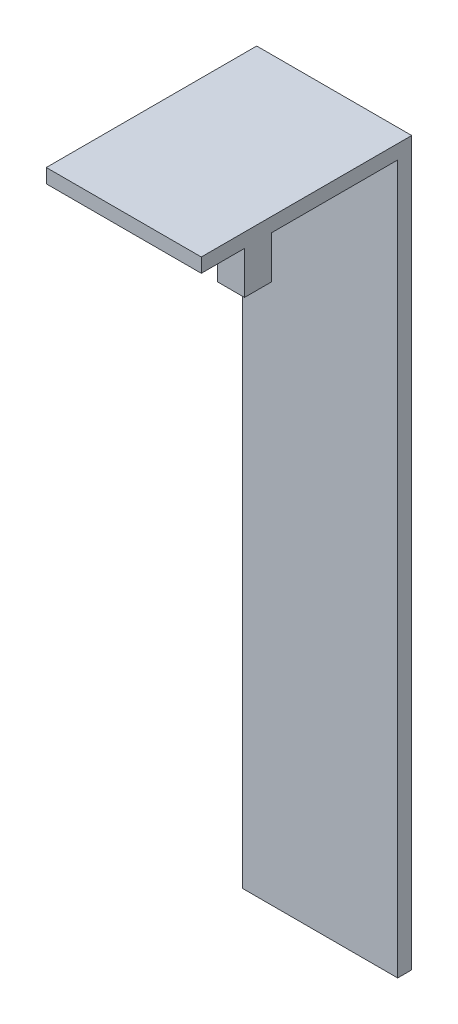
ISO-10303-21;
HEADER;
FILE_DESCRIPTION(('STEP AP214'),'2;1');
FILE_NAME('part.step','',(''),(''),'','','');
FILE_SCHEMA(('AUTOMOTIVE_DESIGN { 1 0 10303 214 1 1 1 1 }'));
ENDSEC;
DATA;
#1=APPLICATION_CONTEXT('core data for automotive mechanical design processes');
#2=APPLICATION_PROTOCOL_DEFINITION('international standard','automotive_design',2000,#1);
#3=PRODUCT_CONTEXT('',#1,'mechanical');
#4=PRODUCT('Part','Part','',(#3));
#5=PRODUCT_RELATED_PRODUCT_CATEGORY('part','',(#4));
#6=PRODUCT_DEFINITION_FORMATION('','',#4);
#7=PRODUCT_DEFINITION_CONTEXT('part definition',#1,'design');
#8=PRODUCT_DEFINITION('design','',#6,#7);
#9=PRODUCT_DEFINITION_SHAPE('','',#8);
#10=(LENGTH_UNIT() NAMED_UNIT(*) SI_UNIT(.MILLI.,.METRE.));
#11=(NAMED_UNIT(*) PLANE_ANGLE_UNIT() SI_UNIT($,.RADIAN.));
#12=(NAMED_UNIT(*) SI_UNIT($,.STERADIAN.) SOLID_ANGLE_UNIT());
#13=UNCERTAINTY_MEASURE_WITH_UNIT(LENGTH_MEASURE(1.E-05),#10,'distance_accuracy_value','');
#14=(GEOMETRIC_REPRESENTATION_CONTEXT(3) GLOBAL_UNCERTAINTY_ASSIGNED_CONTEXT((#13)) GLOBAL_UNIT_ASSIGNED_CONTEXT((#10,
#11,#12)) REPRESENTATION_CONTEXT('',''));
#15=CARTESIAN_POINT('',(0.,0.,0.));
#16=DIRECTION('',(0.,0.,1.));
#17=DIRECTION('',(1.,0.,0.));
#18=AXIS2_PLACEMENT_3D('',#15,#16,#17);
#19=CARTESIAN_POINT('',(0.,0.,0.));
#20=DIRECTION('',(0.,1.,0.));
#21=DIRECTION('',(0.,0.,1.));
#22=AXIS2_PLACEMENT_3D('',#19,#20,#21);
#23=PLANE('',#22);
#24=DIRECTION('',(-1.,0.,0.));
#25=VECTOR('',#24,1.);
#26=CARTESIAN_POINT('',(0.,0.,-8.91));
#27=LINE('',#26,#25);
#28=CARTESIAN_POINT('',(5.46975,0.,-8.91));
#29=VERTEX_POINT('',#28);
#30=CARTESIAN_POINT('',(-5.46975,0.,-8.91));
#31=VERTEX_POINT('',#30);
#32=EDGE_CURVE('E170',#29,#31,#27,.T.);
#33=ORIENTED_EDGE('',*,*,#32,.F.);
#34=DIRECTION('',(0.,0.,1.));
#35=VECTOR('',#34,1.);
#36=CARTESIAN_POINT('',(5.46975,0.,0.));
#37=LINE('',#36,#35);
#38=CARTESIAN_POINT('',(5.46975,0.,0.));
#39=VERTEX_POINT('',#38);
#40=EDGE_CURVE('E161',#29,#39,#37,.T.);
#41=ORIENTED_EDGE('',*,*,#40,.T.);
#42=DIRECTION('',(1.,0.,0.));
#43=VECTOR('',#42,1.);
#44=CARTESIAN_POINT('',(0.,0.,0.));
#45=LINE('',#44,#43);
#46=CARTESIAN_POINT('',(3.56974999999999,0.,0.));
#47=VERTEX_POINT('',#46);
#48=EDGE_CURVE('E199',#47,#39,#45,.T.);
#49=ORIENTED_EDGE('',*,*,#48,.F.);
#50=DIRECTION('',(0.,0.,-1.));
#51=VECTOR('',#50,1.);
#52=CARTESIAN_POINT('',(3.56974999999999,0.,0.));
#53=LINE('',#52,#51);
#54=CARTESIAN_POINT('',(3.56975,0.,1.89999999999999));
#55=VERTEX_POINT('',#54);
#56=EDGE_CURVE('E64',#55,#47,#53,.T.);
#57=ORIENTED_EDGE('',*,*,#56,.F.);
#58=DIRECTION('',(-1.,0.,0.));
#59=VECTOR('',#58,1.);
#60=CARTESIAN_POINT('',(0.,0.,1.9));
#61=LINE('',#60,#59);
#62=CARTESIAN_POINT('',(5.46975,0.,1.89999999999999));
#63=VERTEX_POINT('',#62);
#64=EDGE_CURVE('E180',#63,#55,#61,.T.);
#65=ORIENTED_EDGE('',*,*,#64,.F.);
#66=CARTESIAN_POINT('',(5.46975,0.,4.95));
#67=VERTEX_POINT('',#66);
#68=EDGE_CURVE('E281',#63,#67,#37,.T.);
#69=ORIENTED_EDGE('',*,*,#68,.T.);
#70=DIRECTION('',(1.,0.,0.));
#71=VECTOR('',#70,1.);
#72=CARTESIAN_POINT('',(0.,0.,4.95));
#73=LINE('',#72,#71);
#74=CARTESIAN_POINT('',(-5.46975,0.,4.95));
#75=VERTEX_POINT('',#74);
#76=EDGE_CURVE('E277',#75,#67,#73,.T.);
#77=ORIENTED_EDGE('',*,*,#76,.F.);
#78=DIRECTION('',(0.,0.,-1.));
#79=VECTOR('',#78,1.);
#80=CARTESIAN_POINT('',(-5.46975,0.,0.));
#81=LINE('',#80,#79);
#82=CARTESIAN_POINT('',(-5.46975,0.,1.9));
#83=VERTEX_POINT('',#82);
#84=EDGE_CURVE('E273',#75,#83,#81,.T.);
#85=ORIENTED_EDGE('',*,*,#84,.T.);
#86=DIRECTION('',(1.,0.,0.));
#87=VECTOR('',#86,1.);
#88=CARTESIAN_POINT('',(0.,0.,1.9));
#89=LINE('',#88,#87);
#90=CARTESIAN_POINT('',(-3.56975,0.,1.9));
#91=VERTEX_POINT('',#90);
#92=EDGE_CURVE('E224',#83,#91,#89,.T.);
#93=ORIENTED_EDGE('',*,*,#92,.T.);
#94=DIRECTION('',(0.,0.,-1.));
#95=VECTOR('',#94,1.);
#96=CARTESIAN_POINT('',(-3.56975,0.,0.));
#97=LINE('',#96,#95);
#98=CARTESIAN_POINT('',(-3.56975,0.,0.));
#99=VERTEX_POINT('',#98);
#100=EDGE_CURVE('E208',#91,#99,#97,.T.);
#101=ORIENTED_EDGE('',*,*,#100,.T.);
#102=DIRECTION('',(-1.,0.,0.));
#103=VECTOR('',#102,1.);
#104=CARTESIAN_POINT('',(0.,0.,0.));
#105=LINE('',#104,#103);
#106=CARTESIAN_POINT('',(-5.46975,0.,0.));
#107=VERTEX_POINT('',#106);
#108=EDGE_CURVE('E239',#99,#107,#105,.T.);
#109=ORIENTED_EDGE('',*,*,#108,.T.);
#110=EDGE_CURVE('E57',#107,#31,#81,.T.);
#111=ORIENTED_EDGE('',*,*,#110,.T.);
#112=EDGE_LOOP('',(#33,#41,#49,#57,#65,#69,#77,#85,#93,#101,#109,#111));
#113=FACE_BOUND('',#112,.T.);
#114=ADVANCED_FACE('F41',(#113),#23,.F.);
#115=CARTESIAN_POINT('',(0.,1.,-9.9));
#116=DIRECTION('',(0.,0.,-1.));
#117=DIRECTION('',(-1.,0.,0.));
#118=AXIS2_PLACEMENT_3D('',#115,#116,#117);
#119=PLANE('',#118);
#120=DIRECTION('',(0.,-1.,0.));
#121=VECTOR('',#120,1.);
#122=CARTESIAN_POINT('',(5.46975,1.,-9.9));
#123=LINE('',#122,#121);
#124=CARTESIAN_POINT('',(5.46975,1.,-9.9));
#125=VERTEX_POINT('',#124);
#126=CARTESIAN_POINT('',(5.46975,-50.,-9.9));
#127=VERTEX_POINT('',#126);
#128=EDGE_CURVE('E272',#125,#127,#123,.T.);
#129=ORIENTED_EDGE('',*,*,#128,.T.);
#130=DIRECTION('',(1.,0.,0.));
#131=VECTOR('',#130,1.);
#132=CARTESIAN_POINT('',(0.,-50.,-9.9));
#133=LINE('',#132,#131);
#134=CARTESIAN_POINT('',(-5.46975,-50.,-9.9));
#135=VERTEX_POINT('',#134);
#136=EDGE_CURVE('E153',#135,#127,#133,.T.);
#137=ORIENTED_EDGE('',*,*,#136,.F.);
#138=DIRECTION('',(0.,-1.,0.));
#139=VECTOR('',#138,1.);
#140=CARTESIAN_POINT('',(-5.46975,1.,-9.9));
#141=LINE('',#140,#139);
#142=CARTESIAN_POINT('',(-5.46975,1.,-9.9));
#143=VERTEX_POINT('',#142);
#144=EDGE_CURVE('E11',#143,#135,#141,.T.);
#145=ORIENTED_EDGE('',*,*,#144,.F.);
#146=DIRECTION('',(1.,0.,0.));
#147=VECTOR('',#146,1.);
#148=CARTESIAN_POINT('',(0.,1.,-9.9));
#149=LINE('',#148,#147);
#150=EDGE_CURVE('E257',#143,#125,#149,.T.);
#151=ORIENTED_EDGE('',*,*,#150,.T.);
#152=EDGE_LOOP('',(#129,#137,#145,#151));
#153=FACE_BOUND('',#152,.T.);
#154=ADVANCED_FACE('F43',(#153),#119,.T.);
#155=CARTESIAN_POINT('',(-5.46975,1.,0.));
#156=DIRECTION('',(-1.,0.,0.));
#157=DIRECTION('',(0.,0.,1.));
#158=AXIS2_PLACEMENT_3D('',#155,#156,#157);
#159=PLANE('',#158);
#160=ORIENTED_EDGE('',*,*,#84,.F.);
#161=DIRECTION('',(0.,-1.,0.));
#162=VECTOR('',#161,1.);
#163=CARTESIAN_POINT('',(-5.46975,1.,4.95));
#164=LINE('',#163,#162);
#165=CARTESIAN_POINT('',(-5.46975,1.,4.95));
#166=VERTEX_POINT('',#165);
#167=EDGE_CURVE('E50',#166,#75,#164,.T.);
#168=ORIENTED_EDGE('',*,*,#167,.F.);
#169=DIRECTION('',(0.,0.,-1.));
#170=VECTOR('',#169,1.);
#171=CARTESIAN_POINT('',(-5.46975,1.,0.));
#172=LINE('',#171,#170);
#173=EDGE_CURVE('E261',#166,#143,#172,.T.);
#174=ORIENTED_EDGE('',*,*,#173,.T.);
#175=ORIENTED_EDGE('',*,*,#144,.T.);
#176=DIRECTION('',(0.,0.,-1.));
#177=VECTOR('',#176,1.);
#178=CARTESIAN_POINT('',(-5.46975,-50.,0.));
#179=LINE('',#178,#177);
#180=CARTESIAN_POINT('',(-5.46975,-50.,-8.91));
#181=VERTEX_POINT('',#180);
#182=EDGE_CURVE('E166',#181,#135,#179,.T.);
#183=ORIENTED_EDGE('',*,*,#182,.F.);
#184=DIRECTION('',(0.,1.,0.));
#185=VECTOR('',#184,1.);
#186=CARTESIAN_POINT('',(-5.46975,-50.,-8.91));
#187=LINE('',#186,#185);
#188=EDGE_CURVE('E165',#181,#31,#187,.T.);
#189=ORIENTED_EDGE('',*,*,#188,.T.);
#190=ORIENTED_EDGE('',*,*,#110,.F.);
#191=DIRECTION('',(0.,1.,0.));
#192=VECTOR('',#191,1.);
#193=CARTESIAN_POINT('',(-5.46975,-3.,0.));
#194=LINE('',#193,#192);
#195=CARTESIAN_POINT('',(-5.46975,-3.,0.));
#196=VERTEX_POINT('',#195);
#197=EDGE_CURVE('E252',#196,#107,#194,.T.);
#198=ORIENTED_EDGE('',*,*,#197,.F.);
#199=DIRECTION('',(0.,0.,-1.));
#200=VECTOR('',#199,1.);
#201=CARTESIAN_POINT('',(-5.46975,-3.,0.));
#202=LINE('',#201,#200);
#203=CARTESIAN_POINT('',(-5.46975,-3.,1.9));
#204=VERTEX_POINT('',#203);
#205=EDGE_CURVE('E228',#204,#196,#202,.T.);
#206=ORIENTED_EDGE('',*,*,#205,.F.);
#207=DIRECTION('',(0.,1.,0.));
#208=VECTOR('',#207,1.);
#209=CARTESIAN_POINT('',(-5.46975,-3.,1.9));
#210=LINE('',#209,#208);
#211=EDGE_CURVE('E249',#204,#83,#210,.T.);
#212=ORIENTED_EDGE('',*,*,#211,.T.);
#213=EDGE_LOOP('',(#160,#168,#174,#175,#183,#189,#190,#198,#206,#212));
#214=FACE_BOUND('',#213,.T.);
#215=ADVANCED_FACE('F298',(#214),#159,.T.);
#216=CARTESIAN_POINT('',(0.,1.,4.95));
#217=DIRECTION('',(0.,0.,-1.));
#218=DIRECTION('',(-1.,0.,0.));
#219=AXIS2_PLACEMENT_3D('',#216,#217,#218);
#220=PLANE('',#219);
#221=ORIENTED_EDGE('',*,*,#76,.T.);
#222=DIRECTION('',(0.,-1.,0.));
#223=VECTOR('',#222,1.);
#224=CARTESIAN_POINT('',(5.46975,1.,4.95));
#225=LINE('',#224,#223);
#226=CARTESIAN_POINT('',(5.46975,1.,4.95));
#227=VERTEX_POINT('',#226);
#228=EDGE_CURVE('E286',#227,#67,#225,.T.);
#229=ORIENTED_EDGE('',*,*,#228,.F.);
#230=DIRECTION('',(1.,0.,0.));
#231=VECTOR('',#230,1.);
#232=CARTESIAN_POINT('',(0.,1.,4.95));
#233=LINE('',#232,#231);
#234=EDGE_CURVE('E265',#166,#227,#233,.T.);
#235=ORIENTED_EDGE('',*,*,#234,.F.);
#236=ORIENTED_EDGE('',*,*,#167,.T.);
#237=EDGE_LOOP('',(#221,#229,#235,#236));
#238=FACE_BOUND('',#237,.T.);
#239=ADVANCED_FACE('F293',(#238),#220,.F.);
#240=CARTESIAN_POINT('',(5.46975,1.,0.));
#241=DIRECTION('',(1.,0.,0.));
#242=DIRECTION('',(0.,0.,-1.));
#243=AXIS2_PLACEMENT_3D('',#240,#241,#242);
#244=PLANE('',#243);
#245=ORIENTED_EDGE('',*,*,#40,.F.);
#246=DIRECTION('',(0.,1.,0.));
#247=VECTOR('',#246,1.);
#248=CARTESIAN_POINT('',(5.46975,-50.,-8.91));
#249=LINE('',#248,#247);
#250=CARTESIAN_POINT('',(5.46975,-50.,-8.91));
#251=VERTEX_POINT('',#250);
#252=EDGE_CURVE('E158',#251,#29,#249,.T.);
#253=ORIENTED_EDGE('',*,*,#252,.F.);
#254=DIRECTION('',(0.,0.,1.));
#255=VECTOR('',#254,1.);
#256=CARTESIAN_POINT('',(5.46975,-50.,0.));
#257=LINE('',#256,#255);
#258=EDGE_CURVE('E145',#127,#251,#257,.T.);
#259=ORIENTED_EDGE('',*,*,#258,.F.);
#260=ORIENTED_EDGE('',*,*,#128,.F.);
#261=DIRECTION('',(0.,0.,1.));
#262=VECTOR('',#261,1.);
#263=CARTESIAN_POINT('',(5.46975,1.,0.));
#264=LINE('',#263,#262);
#265=EDGE_CURVE('E268',#125,#227,#264,.T.);
#266=ORIENTED_EDGE('',*,*,#265,.T.);
#267=ORIENTED_EDGE('',*,*,#228,.T.);
#268=ORIENTED_EDGE('',*,*,#68,.F.);
#269=DIRECTION('',(0.,1.,0.));
#270=VECTOR('',#269,1.);
#271=CARTESIAN_POINT('',(5.46975,-3.,1.89999999999999));
#272=LINE('',#271,#270);
#273=CARTESIAN_POINT('',(5.46975,-3.,1.89999999999999));
#274=VERTEX_POINT('',#273);
#275=EDGE_CURVE('E195',#274,#63,#272,.T.);
#276=ORIENTED_EDGE('',*,*,#275,.F.);
#277=DIRECTION('',(0.,0.,1.));
#278=VECTOR('',#277,1.);
#279=CARTESIAN_POINT('',(5.46975,-3.,0.));
#280=LINE('',#279,#278);
#281=CARTESIAN_POINT('',(5.46975,-3.,0.));
#282=VERTEX_POINT('',#281);
#283=EDGE_CURVE('E186',#282,#274,#280,.T.);
#284=ORIENTED_EDGE('',*,*,#283,.F.);
#285=DIRECTION('',(0.,1.,0.));
#286=VECTOR('',#285,1.);
#287=CARTESIAN_POINT('',(5.46975,-3.,0.));
#288=LINE('',#287,#286);
#289=EDGE_CURVE('E213',#282,#39,#288,.T.);
#290=ORIENTED_EDGE('',*,*,#289,.T.);
#291=EDGE_LOOP('',(#245,#253,#259,#260,#266,#267,#268,#276,#284,#290));
#292=FACE_BOUND('',#291,.T.);
#293=ADVANCED_FACE('F159',(#292),#244,.T.);
#294=CARTESIAN_POINT('',(0.,1.,0.));
#295=DIRECTION('',(0.,1.,0.));
#296=DIRECTION('',(0.,0.,1.));
#297=AXIS2_PLACEMENT_3D('',#294,#295,#296);
#298=PLANE('',#297);
#299=ORIENTED_EDGE('',*,*,#150,.F.);
#300=ORIENTED_EDGE('',*,*,#173,.F.);
#301=ORIENTED_EDGE('',*,*,#234,.T.);
#302=ORIENTED_EDGE('',*,*,#265,.F.);
#303=EDGE_LOOP('',(#299,#300,#301,#302));
#304=FACE_BOUND('',#303,.T.);
#305=ADVANCED_FACE('F348',(#304),#298,.T.);
#306=CARTESIAN_POINT('',(-3.56975,-3.,0.));
#307=DIRECTION('',(1.,0.,0.));
#308=DIRECTION('',(0.,0.,-1.));
#309=AXIS2_PLACEMENT_3D('',#306,#307,#308);
#310=PLANE('',#309);
#311=ORIENTED_EDGE('',*,*,#100,.F.);
#312=DIRECTION('',(0.,1.,0.));
#313=VECTOR('',#312,1.);
#314=CARTESIAN_POINT('',(-3.56975,-3.,1.9));
#315=LINE('',#314,#313);
#316=CARTESIAN_POINT('',(-3.56975,-3.,1.9));
#317=VERTEX_POINT('',#316);
#318=EDGE_CURVE('E245',#317,#91,#315,.T.);
#319=ORIENTED_EDGE('',*,*,#318,.F.);
#320=DIRECTION('',(0.,0.,-1.));
#321=VECTOR('',#320,1.);
#322=CARTESIAN_POINT('',(-3.56975,-3.,0.));
#323=LINE('',#322,#321);
#324=CARTESIAN_POINT('',(-3.56975,-3.,0.));
#325=VERTEX_POINT('',#324);
#326=EDGE_CURVE('E219',#317,#325,#323,.T.);
#327=ORIENTED_EDGE('',*,*,#326,.T.);
#328=DIRECTION('',(0.,1.,0.));
#329=VECTOR('',#328,1.);
#330=CARTESIAN_POINT('',(-3.56975,-3.,0.));
#331=LINE('',#330,#329);
#332=EDGE_CURVE('E235',#325,#99,#331,.T.);
#333=ORIENTED_EDGE('',*,*,#332,.T.);
#334=EDGE_LOOP('',(#311,#319,#327,#333));
#335=FACE_BOUND('',#334,.T.);
#336=ADVANCED_FACE('F307',(#335),#310,.T.);
#337=CARTESIAN_POINT('',(0.,-3.,1.9));
#338=DIRECTION('',(0.,0.,1.));
#339=DIRECTION('',(1.,0.,0.));
#340=AXIS2_PLACEMENT_3D('',#337,#338,#339);
#341=PLANE('',#340);
#342=ORIENTED_EDGE('',*,*,#92,.F.);
#343=ORIENTED_EDGE('',*,*,#211,.F.);
#344=DIRECTION('',(1.,0.,0.));
#345=VECTOR('',#344,1.);
#346=CARTESIAN_POINT('',(0.,-3.,1.9));
#347=LINE('',#346,#345);
#348=EDGE_CURVE('E231',#204,#317,#347,.T.);
#349=ORIENTED_EDGE('',*,*,#348,.T.);
#350=ORIENTED_EDGE('',*,*,#318,.T.);
#351=EDGE_LOOP('',(#342,#343,#349,#350));
#352=FACE_BOUND('',#351,.T.);
#353=ADVANCED_FACE('F304',(#352),#341,.T.);
#354=CARTESIAN_POINT('',(0.,-3.,0.));
#355=DIRECTION('',(0.,0.,-1.));
#356=DIRECTION('',(-1.,0.,0.));
#357=AXIS2_PLACEMENT_3D('',#354,#355,#356);
#358=PLANE('',#357);
#359=ORIENTED_EDGE('',*,*,#108,.F.);
#360=ORIENTED_EDGE('',*,*,#332,.F.);
#361=DIRECTION('',(-1.,0.,0.));
#362=VECTOR('',#361,1.);
#363=CARTESIAN_POINT('',(0.,-3.,0.));
#364=LINE('',#363,#362);
#365=EDGE_CURVE('E223',#325,#196,#364,.T.);
#366=ORIENTED_EDGE('',*,*,#365,.T.);
#367=ORIENTED_EDGE('',*,*,#197,.T.);
#368=EDGE_LOOP('',(#359,#360,#366,#367));
#369=FACE_BOUND('',#368,.T.);
#370=ADVANCED_FACE('F311',(#369),#358,.T.);
#371=CARTESIAN_POINT('',(0.,-3.,0.));
#372=DIRECTION('',(0.,1.,0.));
#373=DIRECTION('',(0.,0.,1.));
#374=AXIS2_PLACEMENT_3D('',#371,#372,#373);
#375=PLANE('',#374);
#376=ORIENTED_EDGE('',*,*,#326,.F.);
#377=ORIENTED_EDGE('',*,*,#348,.F.);
#378=ORIENTED_EDGE('',*,*,#205,.T.);
#379=ORIENTED_EDGE('',*,*,#365,.F.);
#380=EDGE_LOOP('',(#376,#377,#378,#379));
#381=FACE_BOUND('',#380,.T.);
#382=ADVANCED_FACE('F330',(#381),#375,.F.);
#383=CARTESIAN_POINT('',(0.,-3.,1.9));
#384=DIRECTION('',(0.,0.,-1.));
#385=DIRECTION('',(-1.,0.,0.));
#386=AXIS2_PLACEMENT_3D('',#383,#384,#385);
#387=PLANE('',#386);
#388=ORIENTED_EDGE('',*,*,#64,.T.);
#389=DIRECTION('',(0.,1.,0.));
#390=VECTOR('',#389,1.);
#391=CARTESIAN_POINT('',(3.56975,-3.,1.89999999999999));
#392=LINE('',#391,#390);
#393=CARTESIAN_POINT('',(3.56975,-3.,1.89999999999999));
#394=VERTEX_POINT('',#393);
#395=EDGE_CURVE('E205',#394,#55,#392,.T.);
#396=ORIENTED_EDGE('',*,*,#395,.F.);
#397=DIRECTION('',(-1.,0.,0.));
#398=VECTOR('',#397,1.);
#399=CARTESIAN_POINT('',(0.,-3.,1.9));
#400=LINE('',#399,#398);
#401=EDGE_CURVE('E182',#274,#394,#400,.T.);
#402=ORIENTED_EDGE('',*,*,#401,.F.);
#403=ORIENTED_EDGE('',*,*,#275,.T.);
#404=EDGE_LOOP('',(#388,#396,#402,#403));
#405=FACE_BOUND('',#404,.T.);
#406=ADVANCED_FACE('F328',(#405),#387,.F.);
#407=CARTESIAN_POINT('',(3.56974999999999,-3.,0.));
#408=DIRECTION('',(1.,0.,0.));
#409=DIRECTION('',(0.,0.,-1.));
#410=AXIS2_PLACEMENT_3D('',#407,#408,#409);
#411=PLANE('',#410);
#412=ORIENTED_EDGE('',*,*,#56,.T.);
#413=DIRECTION('',(0.,1.,0.));
#414=VECTOR('',#413,1.);
#415=CARTESIAN_POINT('',(3.56974999999999,-3.,0.));
#416=LINE('',#415,#414);
#417=CARTESIAN_POINT('',(3.56974999999999,-3.,0.));
#418=VERTEX_POINT('',#417);
#419=EDGE_CURVE('E209',#418,#47,#416,.T.);
#420=ORIENTED_EDGE('',*,*,#419,.F.);
#421=DIRECTION('',(0.,0.,-1.));
#422=VECTOR('',#421,1.);
#423=CARTESIAN_POINT('',(3.56974999999999,-3.,0.));
#424=LINE('',#423,#422);
#425=EDGE_CURVE('E192',#394,#418,#424,.T.);
#426=ORIENTED_EDGE('',*,*,#425,.F.);
#427=ORIENTED_EDGE('',*,*,#395,.T.);
#428=EDGE_LOOP('',(#412,#420,#426,#427));
#429=FACE_BOUND('',#428,.T.);
#430=ADVANCED_FACE('F326',(#429),#411,.F.);
#431=CARTESIAN_POINT('',(0.,-3.,0.));
#432=DIRECTION('',(0.,0.,1.));
#433=DIRECTION('',(1.,0.,0.));
#434=AXIS2_PLACEMENT_3D('',#431,#432,#433);
#435=PLANE('',#434);
#436=ORIENTED_EDGE('',*,*,#48,.T.);
#437=ORIENTED_EDGE('',*,*,#289,.F.);
#438=DIRECTION('',(1.,0.,0.));
#439=VECTOR('',#438,1.);
#440=CARTESIAN_POINT('',(0.,-3.,0.));
#441=LINE('',#440,#439);
#442=EDGE_CURVE('E189',#418,#282,#441,.T.);
#443=ORIENTED_EDGE('',*,*,#442,.F.);
#444=ORIENTED_EDGE('',*,*,#419,.T.);
#445=EDGE_LOOP('',(#436,#437,#443,#444));
#446=FACE_BOUND('',#445,.T.);
#447=ADVANCED_FACE('F316',(#446),#435,.F.);
#448=CARTESIAN_POINT('',(0.,-3.,0.));
#449=DIRECTION('',(0.,1.,0.));
#450=DIRECTION('',(0.,0.,1.));
#451=AXIS2_PLACEMENT_3D('',#448,#449,#450);
#452=PLANE('',#451);
#453=ORIENTED_EDGE('',*,*,#401,.T.);
#454=ORIENTED_EDGE('',*,*,#425,.T.);
#455=ORIENTED_EDGE('',*,*,#442,.T.);
#456=ORIENTED_EDGE('',*,*,#283,.T.);
#457=EDGE_LOOP('',(#453,#454,#455,#456));
#458=FACE_BOUND('',#457,.T.);
#459=ADVANCED_FACE('F323',(#458),#452,.F.);
#460=CARTESIAN_POINT('',(0.,-50.,-8.91));
#461=DIRECTION('',(0.,0.,-1.));
#462=DIRECTION('',(-1.,0.,0.));
#463=AXIS2_PLACEMENT_3D('',#460,#461,#462);
#464=PLANE('',#463);
#465=ORIENTED_EDGE('',*,*,#32,.T.);
#466=ORIENTED_EDGE('',*,*,#188,.F.);
#467=DIRECTION('',(-1.,0.,0.));
#468=VECTOR('',#467,1.);
#469=CARTESIAN_POINT('',(0.,-50.,-8.91));
#470=LINE('',#469,#468);
#471=EDGE_CURVE('E150',#251,#181,#470,.T.);
#472=ORIENTED_EDGE('',*,*,#471,.F.);
#473=ORIENTED_EDGE('',*,*,#252,.T.);
#474=EDGE_LOOP('',(#465,#466,#472,#473));
#475=FACE_BOUND('',#474,.T.);
#476=ADVANCED_FACE('F168',(#475),#464,.F.);
#477=CARTESIAN_POINT('',(0.,-50.,0.));
#478=DIRECTION('',(0.,1.,0.));
#479=DIRECTION('',(0.,0.,1.));
#480=AXIS2_PLACEMENT_3D('',#477,#478,#479);
#481=PLANE('',#480);
#482=ORIENTED_EDGE('',*,*,#471,.T.);
#483=ORIENTED_EDGE('',*,*,#182,.T.);
#484=ORIENTED_EDGE('',*,*,#136,.T.);
#485=ORIENTED_EDGE('',*,*,#258,.T.);
#486=EDGE_LOOP('',(#482,#483,#484,#485));
#487=FACE_BOUND('',#486,.T.);
#488=ADVANCED_FACE('F147',(#487),#481,.F.);
#489=CLOSED_SHELL('',(#114,#154,#215,#239,#293,#305,#336,#353,#370,#382,#406,#430,#447,#459,
#476,#488));
#490=MANIFOLD_SOLID_BREP('B2',#489);
#491=ADVANCED_BREP_SHAPE_REPRESENTATION('',(#18,#490),#14);
#492=SHAPE_DEFINITION_REPRESENTATION(#9,#491);
ENDSEC;
END-ISO-10303-21;
